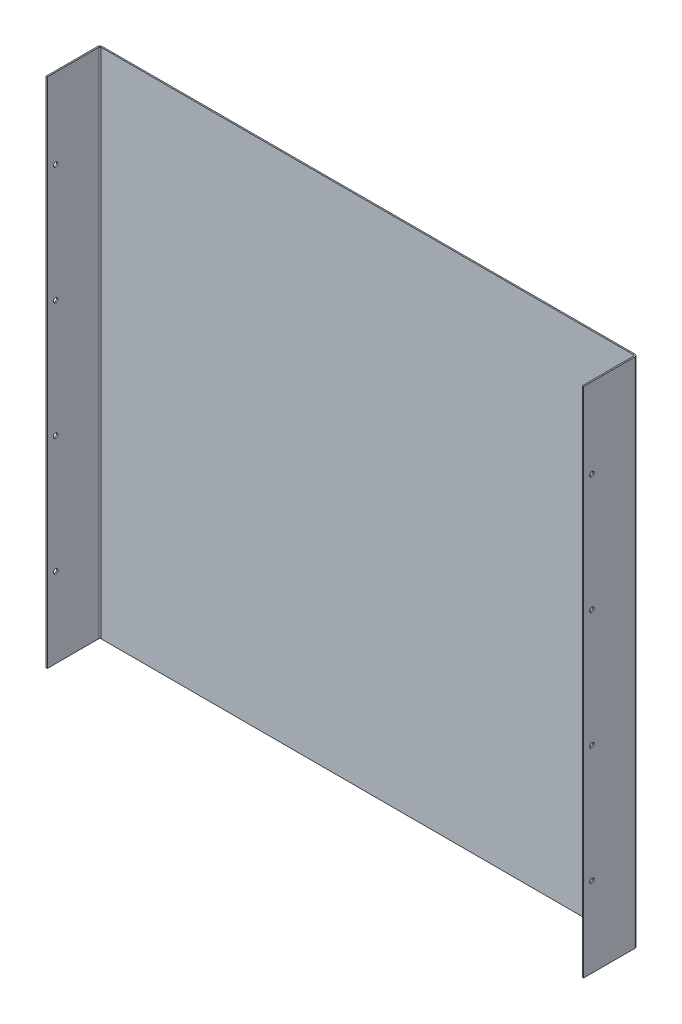
ISO-10303-21;
HEADER;
FILE_DESCRIPTION(('STEP AP214'),'2;1');
FILE_NAME('part.step','',(''),(''),'','','');
FILE_SCHEMA(('AUTOMOTIVE_DESIGN { 1 0 10303 214 1 1 1 1 }'));
ENDSEC;
DATA;
#1=APPLICATION_CONTEXT('core data for automotive mechanical design processes');
#2=APPLICATION_PROTOCOL_DEFINITION('international standard','automotive_design',2000,#1);
#3=PRODUCT_CONTEXT('',#1,'mechanical');
#4=PRODUCT('Part','Part','',(#3));
#5=PRODUCT_RELATED_PRODUCT_CATEGORY('part','',(#4));
#6=PRODUCT_DEFINITION_FORMATION('','',#4);
#7=PRODUCT_DEFINITION_CONTEXT('part definition',#1,'design');
#8=PRODUCT_DEFINITION('design','',#6,#7);
#9=PRODUCT_DEFINITION_SHAPE('','',#8);
#10=(LENGTH_UNIT() NAMED_UNIT(*) SI_UNIT(.MILLI.,.METRE.));
#11=(NAMED_UNIT(*) PLANE_ANGLE_UNIT() SI_UNIT($,.RADIAN.));
#12=(NAMED_UNIT(*) SI_UNIT($,.STERADIAN.) SOLID_ANGLE_UNIT());
#13=UNCERTAINTY_MEASURE_WITH_UNIT(LENGTH_MEASURE(1.E-05),#10,'distance_accuracy_value','');
#14=(GEOMETRIC_REPRESENTATION_CONTEXT(3) GLOBAL_UNCERTAINTY_ASSIGNED_CONTEXT((#13)) GLOBAL_UNIT_ASSIGNED_CONTEXT((#10,
#11,#12)) REPRESENTATION_CONTEXT('',''));
#15=CARTESIAN_POINT('',(0.,0.,0.));
#16=DIRECTION('',(0.,0.,1.));
#17=DIRECTION('',(1.,0.,0.));
#18=AXIS2_PLACEMENT_3D('',#15,#16,#17);
#19=CARTESIAN_POINT('',(0.,0.,0.));
#20=DIRECTION('',(1.,0.,0.));
#21=DIRECTION('',(0.,0.,-1.));
#22=AXIS2_PLACEMENT_3D('',#19,#20,#21);
#23=PLANE('',#22);
#24=CARTESIAN_POINT('',(-1.11022302462516E-13,337.5,35.499999999994));
#25=DIRECTION('',(-1.,0.,0.));
#26=DIRECTION('',(0.,0.,1.));
#27=AXIS2_PLACEMENT_3D('',#24,#25,#26);
#28=CIRCLE('',#27,1.75);
#29=CARTESIAN_POINT('',(-1.17132394805491E-13,337.5,37.249999999994));
#30=VERTEX_POINT('',#29);
#31=EDGE_CURVE('E108',#30,#30,#28,.F.);
#32=ORIENTED_EDGE('',*,*,#31,.T.);
#33=EDGE_LOOP('',(#32));
#34=FACE_BOUND('',#33,.T.);
#35=CARTESIAN_POINT('',(-1.11022302462516E-13,245.8,35.4999999999949));
#36=DIRECTION('',(-1.,0.,0.));
#37=DIRECTION('',(0.,0.,1.));
#38=AXIS2_PLACEMENT_3D('',#35,#36,#37);
#39=CIRCLE('',#38,1.75);
#40=CARTESIAN_POINT('',(-1.17132394805491E-13,245.8,37.2499999999949));
#41=VERTEX_POINT('',#40);
#42=EDGE_CURVE('E105',#41,#41,#39,.F.);
#43=ORIENTED_EDGE('',*,*,#42,.T.);
#44=EDGE_LOOP('',(#43));
#45=FACE_BOUND('',#44,.T.);
#46=CARTESIAN_POINT('',(-1.11022302462516E-13,154.2,35.4999999999958));
#47=DIRECTION('',(-1.,0.,0.));
#48=DIRECTION('',(0.,0.,1.));
#49=AXIS2_PLACEMENT_3D('',#46,#47,#48);
#50=CIRCLE('',#49,1.75);
#51=CARTESIAN_POINT('',(-1.17132394805491E-13,154.2,37.2499999999958));
#52=VERTEX_POINT('',#51);
#53=EDGE_CURVE('E101',#52,#52,#50,.F.);
#54=ORIENTED_EDGE('',*,*,#53,.T.);
#55=EDGE_LOOP('',(#54));
#56=FACE_BOUND('',#55,.T.);
#57=CARTESIAN_POINT('',(-1.11022302462516E-13,62.4999999999995,35.4999999999967));
#58=DIRECTION('',(-1.,0.,0.));
#59=DIRECTION('',(0.,0.,1.));
#60=AXIS2_PLACEMENT_3D('',#57,#58,#59);
#61=CIRCLE('',#60,1.75);
#62=CARTESIAN_POINT('',(-1.17132394805491E-13,62.4999999999995,37.2499999999967));
#63=VERTEX_POINT('',#62);
#64=EDGE_CURVE('E98',#63,#63,#61,.F.);
#65=ORIENTED_EDGE('',*,*,#64,.T.);
#66=EDGE_LOOP('',(#65));
#67=FACE_BOUND('',#66,.T.);
#68=DIRECTION('',(0.,0.,1.));
#69=VECTOR('',#68,1.);
#70=CARTESIAN_POINT('',(0.,0.,42.));
#71=LINE('',#70,#69);
#72=CARTESIAN_POINT('',(0.,0.,2.));
#73=VERTEX_POINT('',#72);
#74=CARTESIAN_POINT('',(0.,0.,42.));
#75=VERTEX_POINT('',#74);
#76=EDGE_CURVE('E97',#73,#75,#71,.T.);
#77=ORIENTED_EDGE('',*,*,#76,.T.);
#78=DIRECTION('',(0.,1.,0.));
#79=VECTOR('',#78,1.);
#80=CARTESIAN_POINT('',(-1.43172769279458E-13,400.,42.));
#81=LINE('',#80,#79);
#82=CARTESIAN_POINT('',(-1.43172769279458E-13,400.,42.));
#83=VERTEX_POINT('',#82);
#84=EDGE_CURVE('E180',#75,#83,#81,.T.);
#85=ORIENTED_EDGE('',*,*,#84,.T.);
#86=DIRECTION('',(0.,0.,-1.));
#87=VECTOR('',#86,1.);
#88=CARTESIAN_POINT('',(-1.43172769279458E-13,400.,0.999999999999997));
#89=LINE('',#88,#87);
#90=CARTESIAN_POINT('',(0.,400.,1.99999999999999));
#91=VERTEX_POINT('',#90);
#92=EDGE_CURVE('E181',#83,#91,#89,.T.);
#93=ORIENTED_EDGE('',*,*,#92,.T.);
#94=DIRECTION('',(0.,-1.,0.));
#95=VECTOR('',#94,1.);
#96=CARTESIAN_POINT('',(0.,0.,1.99999999999999));
#97=LINE('',#96,#95);
#98=EDGE_CURVE('E119',#73,#91,#97,.F.);
#99=ORIENTED_EDGE('',*,*,#98,.F.);
#100=EDGE_LOOP('',(#77,#85,#93,#99));
#101=FACE_BOUND('',#100,.T.);
#102=ADVANCED_FACE('F16',(#34,#45,#56,#67,#101),#23,.F.);
#103=CARTESIAN_POINT('',(419.7,0.,0.));
#104=DIRECTION('',(-1.,0.,0.));
#105=DIRECTION('',(0.,0.,1.));
#106=AXIS2_PLACEMENT_3D('',#103,#104,#105);
#107=PLANE('',#106);
#108=CARTESIAN_POINT('',(419.7,337.5,35.4999999999955));
#109=DIRECTION('',(-1.,0.,0.));
#110=DIRECTION('',(0.,0.,1.));
#111=AXIS2_PLACEMENT_3D('',#108,#109,#110);
#112=CIRCLE('',#111,1.75);
#113=CARTESIAN_POINT('',(419.7,337.5,37.2499999999955));
#114=VERTEX_POINT('',#113);
#115=EDGE_CURVE('E133',#114,#114,#112,.T.);
#116=ORIENTED_EDGE('',*,*,#115,.T.);
#117=EDGE_LOOP('',(#116));
#118=FACE_BOUND('',#117,.T.);
#119=CARTESIAN_POINT('',(419.7,245.8,35.4999999999964));
#120=DIRECTION('',(-1.,0.,0.));
#121=DIRECTION('',(0.,0.,1.));
#122=AXIS2_PLACEMENT_3D('',#119,#120,#121);
#123=CIRCLE('',#122,1.75);
#124=CARTESIAN_POINT('',(419.7,245.8,37.2499999999964));
#125=VERTEX_POINT('',#124);
#126=EDGE_CURVE('E130',#125,#125,#123,.T.);
#127=ORIENTED_EDGE('',*,*,#126,.T.);
#128=EDGE_LOOP('',(#127));
#129=FACE_BOUND('',#128,.T.);
#130=CARTESIAN_POINT('',(419.7,154.2,35.4999999999973));
#131=DIRECTION('',(-1.,0.,0.));
#132=DIRECTION('',(0.,0.,1.));
#133=AXIS2_PLACEMENT_3D('',#130,#131,#132);
#134=CIRCLE('',#133,1.75);
#135=CARTESIAN_POINT('',(419.7,154.2,37.2499999999973));
#136=VERTEX_POINT('',#135);
#137=EDGE_CURVE('E126',#136,#136,#134,.T.);
#138=ORIENTED_EDGE('',*,*,#137,.T.);
#139=EDGE_LOOP('',(#138));
#140=FACE_BOUND('',#139,.T.);
#141=CARTESIAN_POINT('',(419.7,62.4999999999995,35.4999999999982));
#142=DIRECTION('',(-1.,0.,0.));
#143=DIRECTION('',(0.,0.,1.));
#144=AXIS2_PLACEMENT_3D('',#141,#142,#143);
#145=CIRCLE('',#144,1.75);
#146=CARTESIAN_POINT('',(419.7,62.4999999999995,37.2499999999982));
#147=VERTEX_POINT('',#146);
#148=EDGE_CURVE('E123',#147,#147,#145,.T.);
#149=ORIENTED_EDGE('',*,*,#148,.T.);
#150=EDGE_LOOP('',(#149));
#151=FACE_BOUND('',#150,.T.);
#152=DIRECTION('',(0.,0.,-1.));
#153=VECTOR('',#152,1.);
#154=CARTESIAN_POINT('',(419.7,400.,42.));
#155=LINE('',#154,#153);
#156=CARTESIAN_POINT('',(419.7,400.,2.00000000000001));
#157=VERTEX_POINT('',#156);
#158=CARTESIAN_POINT('',(419.7,400.,42.));
#159=VERTEX_POINT('',#158);
#160=EDGE_CURVE('E122',#157,#159,#155,.F.);
#161=ORIENTED_EDGE('',*,*,#160,.T.);
#162=DIRECTION('',(0.,1.,0.));
#163=VECTOR('',#162,1.);
#164=CARTESIAN_POINT('',(419.7,0.,42.));
#165=LINE('',#164,#163);
#166=CARTESIAN_POINT('',(419.7,0.,42.));
#167=VERTEX_POINT('',#166);
#168=EDGE_CURVE('E226',#159,#167,#165,.F.);
#169=ORIENTED_EDGE('',*,*,#168,.T.);
#170=DIRECTION('',(0.,0.,1.));
#171=VECTOR('',#170,1.);
#172=CARTESIAN_POINT('',(419.7,0.,0.999999999999997));
#173=LINE('',#172,#171);
#174=CARTESIAN_POINT('',(419.7,0.,2.00000000000001));
#175=VERTEX_POINT('',#174);
#176=EDGE_CURVE('E208',#167,#175,#173,.F.);
#177=ORIENTED_EDGE('',*,*,#176,.T.);
#178=DIRECTION('',(0.,1.,0.));
#179=VECTOR('',#178,1.);
#180=CARTESIAN_POINT('',(419.7,400.,2.));
#181=LINE('',#180,#179);
#182=EDGE_CURVE('E112',#157,#175,#181,.F.);
#183=ORIENTED_EDGE('',*,*,#182,.F.);
#184=EDGE_LOOP('',(#161,#169,#177,#183));
#185=FACE_BOUND('',#184,.T.);
#186=ADVANCED_FACE('F251',(#118,#129,#140,#151,#185),#107,.F.);
#187=CARTESIAN_POINT('',(0.,400.,42.));
#188=DIRECTION('',(0.,0.,-1.));
#189=DIRECTION('',(-1.,0.,0.));
#190=AXIS2_PLACEMENT_3D('',#187,#188,#189);
#191=PLANE('',#190);
#192=DIRECTION('',(-1.,0.,0.));
#193=VECTOR('',#192,1.);
#194=CARTESIAN_POINT('',(0.,400.,42.));
#195=LINE('',#194,#193);
#196=CARTESIAN_POINT('',(0.999999999999926,400.,42.));
#197=VERTEX_POINT('',#196);
#198=EDGE_CURVE('E102',#83,#197,#195,.F.);
#199=ORIENTED_EDGE('',*,*,#198,.F.);
#200=ORIENTED_EDGE('',*,*,#84,.F.);
#201=DIRECTION('',(-1.,0.,0.));
#202=VECTOR('',#201,1.);
#203=CARTESIAN_POINT('',(0.,0.,42.));
#204=LINE('',#203,#202);
#205=CARTESIAN_POINT('',(0.999999999999856,0.,42.));
#206=VERTEX_POINT('',#205);
#207=EDGE_CURVE('E177',#206,#75,#204,.T.);
#208=ORIENTED_EDGE('',*,*,#207,.F.);
#209=DIRECTION('',(0.,1.,0.));
#210=VECTOR('',#209,1.);
#211=CARTESIAN_POINT('',(0.999999999999853,0.,42.));
#212=LINE('',#211,#210);
#213=EDGE_CURVE('E141',#197,#206,#212,.F.);
#214=ORIENTED_EDGE('',*,*,#213,.F.);
#215=EDGE_LOOP('',(#199,#200,#208,#214));
#216=FACE_BOUND('',#215,.T.);
#217=ADVANCED_FACE('F283',(#216),#191,.F.);
#218=CARTESIAN_POINT('',(419.7,62.4999999999995,35.4999999999982));
#219=DIRECTION('',(-1.,0.,0.));
#220=DIRECTION('',(0.,0.,1.));
#221=AXIS2_PLACEMENT_3D('',#218,#219,#220);
#222=CYLINDRICAL_SURFACE('',#221,1.75);
#223=ORIENTED_EDGE('',*,*,#64,.F.);
#224=EDGE_LOOP('',(#223));
#225=FACE_BOUND('',#224,.T.);
#226=CARTESIAN_POINT('',(0.99999999999989,62.4999999999995,35.4999999999967));
#227=DIRECTION('',(-1.,0.,0.));
#228=DIRECTION('',(0.,0.,1.));
#229=AXIS2_PLACEMENT_3D('',#226,#227,#228);
#230=CIRCLE('',#229,1.75);
#231=CARTESIAN_POINT('',(0.999999999999884,62.4999999999995,37.2499999999967));
#232=VERTEX_POINT('',#231);
#233=EDGE_CURVE('E137',#232,#232,#230,.T.);
#234=ORIENTED_EDGE('',*,*,#233,.F.);
#235=EDGE_LOOP('',(#234));
#236=FACE_BOUND('',#235,.T.);
#237=ADVANCED_FACE('F449',(#225,#236),#222,.F.);
#238=CARTESIAN_POINT('',(419.7,154.2,35.4999999999973));
#239=DIRECTION('',(-1.,0.,0.));
#240=DIRECTION('',(0.,0.,1.));
#241=AXIS2_PLACEMENT_3D('',#238,#239,#240);
#242=CYLINDRICAL_SURFACE('',#241,1.75);
#243=ORIENTED_EDGE('',*,*,#53,.F.);
#244=EDGE_LOOP('',(#243));
#245=FACE_BOUND('',#244,.T.);
#246=CARTESIAN_POINT('',(0.99999999999989,154.2,35.4999999999958));
#247=DIRECTION('',(-1.,0.,0.));
#248=DIRECTION('',(0.,0.,1.));
#249=AXIS2_PLACEMENT_3D('',#246,#247,#248);
#250=CIRCLE('',#249,1.75);
#251=CARTESIAN_POINT('',(0.999999999999884,154.2,37.2499999999958));
#252=VERTEX_POINT('',#251);
#253=EDGE_CURVE('E140',#252,#252,#250,.T.);
#254=ORIENTED_EDGE('',*,*,#253,.F.);
#255=EDGE_LOOP('',(#254));
#256=FACE_BOUND('',#255,.T.);
#257=ADVANCED_FACE('F439',(#245,#256),#242,.F.);
#258=CARTESIAN_POINT('',(419.7,245.8,35.4999999999964));
#259=DIRECTION('',(-1.,0.,0.));
#260=DIRECTION('',(0.,0.,1.));
#261=AXIS2_PLACEMENT_3D('',#258,#259,#260);
#262=CYLINDRICAL_SURFACE('',#261,1.75);
#263=ORIENTED_EDGE('',*,*,#42,.F.);
#264=EDGE_LOOP('',(#263));
#265=FACE_BOUND('',#264,.T.);
#266=CARTESIAN_POINT('',(0.99999999999989,245.8,35.4999999999949));
#267=DIRECTION('',(-1.,0.,0.));
#268=DIRECTION('',(0.,0.,1.));
#269=AXIS2_PLACEMENT_3D('',#266,#267,#268);
#270=CIRCLE('',#269,1.75);
#271=CARTESIAN_POINT('',(0.999999999999884,245.8,37.2499999999949));
#272=VERTEX_POINT('',#271);
#273=EDGE_CURVE('E144',#272,#272,#270,.T.);
#274=ORIENTED_EDGE('',*,*,#273,.F.);
#275=EDGE_LOOP('',(#274));
#276=FACE_BOUND('',#275,.T.);
#277=ADVANCED_FACE('F429',(#265,#276),#262,.F.);
#278=CARTESIAN_POINT('',(419.7,337.5,35.4999999999955));
#279=DIRECTION('',(-1.,0.,0.));
#280=DIRECTION('',(0.,0.,1.));
#281=AXIS2_PLACEMENT_3D('',#278,#279,#280);
#282=CYLINDRICAL_SURFACE('',#281,1.75);
#283=ORIENTED_EDGE('',*,*,#31,.F.);
#284=EDGE_LOOP('',(#283));
#285=FACE_BOUND('',#284,.T.);
#286=CARTESIAN_POINT('',(0.99999999999989,337.5,35.499999999994));
#287=DIRECTION('',(-1.,0.,0.));
#288=DIRECTION('',(0.,0.,1.));
#289=AXIS2_PLACEMENT_3D('',#286,#287,#288);
#290=CIRCLE('',#289,1.75);
#291=CARTESIAN_POINT('',(0.999999999999884,337.5,37.249999999994));
#292=VERTEX_POINT('',#291);
#293=EDGE_CURVE('E147',#292,#292,#290,.T.);
#294=ORIENTED_EDGE('',*,*,#293,.F.);
#295=EDGE_LOOP('',(#294));
#296=FACE_BOUND('',#295,.T.);
#297=ADVANCED_FACE('F420',(#285,#296),#282,.F.);
#298=CARTESIAN_POINT('',(417.7,400.,2.00000000000001));
#299=DIRECTION('',(0.,1.,0.));
#300=DIRECTION('',(0.,0.,1.));
#301=AXIS2_PLACEMENT_3D('',#298,#299,#300);
#302=CYLINDRICAL_SURFACE('',#301,2.);
#303=ORIENTED_EDGE('',*,*,#182,.T.);
#304=CARTESIAN_POINT('',(417.7,0.,2.00000000000001));
#305=DIRECTION('',(0.,1.,0.));
#306=DIRECTION('',(0.,0.,1.));
#307=AXIS2_PLACEMENT_3D('',#304,#305,#306);
#308=CIRCLE('',#307,2.);
#309=CARTESIAN_POINT('',(417.7,0.,0.));
#310=VERTEX_POINT('',#309);
#311=EDGE_CURVE('E113',#175,#310,#308,.T.);
#312=ORIENTED_EDGE('',*,*,#311,.T.);
#313=DIRECTION('',(0.,1.,0.));
#314=VECTOR('',#313,1.);
#315=CARTESIAN_POINT('',(417.7,0.,0.));
#316=LINE('',#315,#314);
#317=CARTESIAN_POINT('',(417.7,400.,0.));
#318=VERTEX_POINT('',#317);
#319=EDGE_CURVE('E150',#318,#310,#316,.F.);
#320=ORIENTED_EDGE('',*,*,#319,.F.);
#321=CARTESIAN_POINT('',(417.7,400.,2.00000000000001));
#322=DIRECTION('',(0.,1.,0.));
#323=DIRECTION('',(0.,0.,1.));
#324=AXIS2_PLACEMENT_3D('',#321,#322,#323);
#325=CIRCLE('',#324,2.);
#326=EDGE_CURVE('E34',#318,#157,#325,.F.);
#327=ORIENTED_EDGE('',*,*,#326,.T.);
#328=EDGE_LOOP('',(#303,#312,#320,#327));
#329=FACE_BOUND('',#328,.T.);
#330=ADVANCED_FACE('F271',(#329),#302,.T.);
#331=CARTESIAN_POINT('',(2.,0.,2.));
#332=DIRECTION('',(0.,-1.,0.));
#333=DIRECTION('',(0.,0.,-1.));
#334=AXIS2_PLACEMENT_3D('',#331,#332,#333);
#335=CYLINDRICAL_SURFACE('',#334,2.);
#336=ORIENTED_EDGE('',*,*,#98,.T.);
#337=CARTESIAN_POINT('',(2.,400.,2.));
#338=DIRECTION('',(0.,-1.,0.));
#339=DIRECTION('',(0.,0.,-1.));
#340=AXIS2_PLACEMENT_3D('',#337,#338,#339);
#341=CIRCLE('',#340,2.);
#342=CARTESIAN_POINT('',(2.,400.,0.));
#343=VERTEX_POINT('',#342);
#344=EDGE_CURVE('E120',#91,#343,#341,.T.);
#345=ORIENTED_EDGE('',*,*,#344,.T.);
#346=DIRECTION('',(0.,1.,0.));
#347=VECTOR('',#346,1.);
#348=CARTESIAN_POINT('',(2.,0.,0.));
#349=LINE('',#348,#347);
#350=CARTESIAN_POINT('',(2.,0.,0.));
#351=VERTEX_POINT('',#350);
#352=EDGE_CURVE('E168',#351,#343,#349,.T.);
#353=ORIENTED_EDGE('',*,*,#352,.F.);
#354=CARTESIAN_POINT('',(2.,0.,2.));
#355=DIRECTION('',(0.,-1.,0.));
#356=DIRECTION('',(0.,0.,-1.));
#357=AXIS2_PLACEMENT_3D('',#354,#355,#356);
#358=CIRCLE('',#357,2.);
#359=EDGE_CURVE('E116',#351,#73,#358,.F.);
#360=ORIENTED_EDGE('',*,*,#359,.T.);
#361=EDGE_LOOP('',(#336,#345,#353,#360));
#362=FACE_BOUND('',#361,.T.);
#363=ADVANCED_FACE('F279',(#362),#335,.T.);
#364=CARTESIAN_POINT('',(419.7,0.,42.));
#365=DIRECTION('',(0.,0.,-1.));
#366=DIRECTION('',(-1.,0.,0.));
#367=AXIS2_PLACEMENT_3D('',#364,#365,#366);
#368=PLANE('',#367);
#369=DIRECTION('',(-1.,0.,0.));
#370=VECTOR('',#369,1.);
#371=CARTESIAN_POINT('',(419.7,0.,42.));
#372=LINE('',#371,#370);
#373=CARTESIAN_POINT('',(418.7,0.,42.));
#374=VERTEX_POINT('',#373);
#375=EDGE_CURVE('E127',#167,#374,#372,.T.);
#376=ORIENTED_EDGE('',*,*,#375,.F.);
#377=ORIENTED_EDGE('',*,*,#168,.F.);
#378=DIRECTION('',(-1.,0.,0.));
#379=VECTOR('',#378,1.);
#380=CARTESIAN_POINT('',(419.7,400.,42.));
#381=LINE('',#380,#379);
#382=CARTESIAN_POINT('',(418.7,400.,42.));
#383=VERTEX_POINT('',#382);
#384=EDGE_CURVE('E211',#383,#159,#381,.F.);
#385=ORIENTED_EDGE('',*,*,#384,.F.);
#386=DIRECTION('',(0.,1.,0.));
#387=VECTOR('',#386,1.);
#388=CARTESIAN_POINT('',(418.7,0.,42.));
#389=LINE('',#388,#387);
#390=EDGE_CURVE('E155',#374,#383,#389,.T.);
#391=ORIENTED_EDGE('',*,*,#390,.F.);
#392=EDGE_LOOP('',(#376,#377,#385,#391));
#393=FACE_BOUND('',#392,.T.);
#394=ADVANCED_FACE('F249',(#393),#368,.F.);
#395=CARTESIAN_POINT('',(419.7,62.4999999999995,35.4999999999982));
#396=DIRECTION('',(-1.,0.,0.));
#397=DIRECTION('',(0.,0.,1.));
#398=AXIS2_PLACEMENT_3D('',#395,#396,#397);
#399=CYLINDRICAL_SURFACE('',#398,1.75);
#400=CARTESIAN_POINT('',(418.7,62.4999999999995,35.4999999999982));
#401=DIRECTION('',(-1.,0.,0.));
#402=DIRECTION('',(0.,0.,1.));
#403=AXIS2_PLACEMENT_3D('',#400,#401,#402);
#404=CIRCLE('',#403,1.75);
#405=CARTESIAN_POINT('',(418.7,62.4999999999995,37.2499999999982));
#406=VERTEX_POINT('',#405);
#407=EDGE_CURVE('E151',#406,#406,#404,.F.);
#408=ORIENTED_EDGE('',*,*,#407,.F.);
#409=EDGE_LOOP('',(#408));
#410=FACE_BOUND('',#409,.T.);
#411=ORIENTED_EDGE('',*,*,#148,.F.);
#412=EDGE_LOOP('',(#411));
#413=FACE_BOUND('',#412,.T.);
#414=ADVANCED_FACE('F385',(#410,#413),#399,.F.);
#415=CARTESIAN_POINT('',(419.7,154.2,35.4999999999973));
#416=DIRECTION('',(-1.,0.,0.));
#417=DIRECTION('',(0.,0.,1.));
#418=AXIS2_PLACEMENT_3D('',#415,#416,#417);
#419=CYLINDRICAL_SURFACE('',#418,1.75);
#420=CARTESIAN_POINT('',(418.7,154.2,35.4999999999973));
#421=DIRECTION('',(-1.,0.,0.));
#422=DIRECTION('',(0.,0.,1.));
#423=AXIS2_PLACEMENT_3D('',#420,#421,#422);
#424=CIRCLE('',#423,1.75);
#425=CARTESIAN_POINT('',(418.7,154.2,37.2499999999973));
#426=VERTEX_POINT('',#425);
#427=EDGE_CURVE('E154',#426,#426,#424,.F.);
#428=ORIENTED_EDGE('',*,*,#427,.F.);
#429=EDGE_LOOP('',(#428));
#430=FACE_BOUND('',#429,.T.);
#431=ORIENTED_EDGE('',*,*,#137,.F.);
#432=EDGE_LOOP('',(#431));
#433=FACE_BOUND('',#432,.T.);
#434=ADVANCED_FACE('F375',(#430,#433),#419,.F.);
#435=CARTESIAN_POINT('',(419.7,245.8,35.4999999999964));
#436=DIRECTION('',(-1.,0.,0.));
#437=DIRECTION('',(0.,0.,1.));
#438=AXIS2_PLACEMENT_3D('',#435,#436,#437);
#439=CYLINDRICAL_SURFACE('',#438,1.75);
#440=CARTESIAN_POINT('',(418.7,245.8,35.4999999999964));
#441=DIRECTION('',(-1.,0.,0.));
#442=DIRECTION('',(0.,0.,1.));
#443=AXIS2_PLACEMENT_3D('',#440,#441,#442);
#444=CIRCLE('',#443,1.75);
#445=CARTESIAN_POINT('',(418.7,245.8,37.2499999999964));
#446=VERTEX_POINT('',#445);
#447=EDGE_CURVE('E158',#446,#446,#444,.F.);
#448=ORIENTED_EDGE('',*,*,#447,.F.);
#449=EDGE_LOOP('',(#448));
#450=FACE_BOUND('',#449,.T.);
#451=ORIENTED_EDGE('',*,*,#126,.F.);
#452=EDGE_LOOP('',(#451));
#453=FACE_BOUND('',#452,.T.);
#454=ADVANCED_FACE('F365',(#450,#453),#439,.F.);
#455=CARTESIAN_POINT('',(419.7,337.5,35.4999999999955));
#456=DIRECTION('',(-1.,0.,0.));
#457=DIRECTION('',(0.,0.,1.));
#458=AXIS2_PLACEMENT_3D('',#455,#456,#457);
#459=CYLINDRICAL_SURFACE('',#458,1.75);
#460=CARTESIAN_POINT('',(418.7,337.5,35.4999999999955));
#461=DIRECTION('',(-1.,0.,0.));
#462=DIRECTION('',(0.,0.,1.));
#463=AXIS2_PLACEMENT_3D('',#460,#461,#462);
#464=CIRCLE('',#463,1.75);
#465=CARTESIAN_POINT('',(418.7,337.5,37.2499999999955));
#466=VERTEX_POINT('',#465);
#467=EDGE_CURVE('E161',#466,#466,#464,.F.);
#468=ORIENTED_EDGE('',*,*,#467,.F.);
#469=EDGE_LOOP('',(#468));
#470=FACE_BOUND('',#469,.T.);
#471=ORIENTED_EDGE('',*,*,#115,.F.);
#472=EDGE_LOOP('',(#471));
#473=FACE_BOUND('',#472,.T.);
#474=ADVANCED_FACE('F355',(#470,#473),#459,.F.);
#475=CARTESIAN_POINT('',(1.,0.,0.));
#476=DIRECTION('',(1.,0.,0.));
#477=DIRECTION('',(0.,0.,-1.));
#478=AXIS2_PLACEMENT_3D('',#475,#476,#477);
#479=PLANE('',#478);
#480=ORIENTED_EDGE('',*,*,#293,.T.);
#481=EDGE_LOOP('',(#480));
#482=FACE_BOUND('',#481,.T.);
#483=ORIENTED_EDGE('',*,*,#273,.T.);
#484=EDGE_LOOP('',(#483));
#485=FACE_BOUND('',#484,.T.);
#486=ORIENTED_EDGE('',*,*,#253,.T.);
#487=EDGE_LOOP('',(#486));
#488=FACE_BOUND('',#487,.T.);
#489=ORIENTED_EDGE('',*,*,#233,.T.);
#490=EDGE_LOOP('',(#489));
#491=FACE_BOUND('',#490,.T.);
#492=DIRECTION('',(0.,0.,-1.));
#493=VECTOR('',#492,1.);
#494=CARTESIAN_POINT('',(1.,400.,0.));
#495=LINE('',#494,#493);
#496=CARTESIAN_POINT('',(0.999999999999997,400.,1.99999999999999));
#497=VERTEX_POINT('',#496);
#498=EDGE_CURVE('E188',#497,#197,#495,.F.);
#499=ORIENTED_EDGE('',*,*,#498,.T.);
#500=ORIENTED_EDGE('',*,*,#213,.T.);
#501=DIRECTION('',(0.,0.,-1.));
#502=VECTOR('',#501,1.);
#503=CARTESIAN_POINT('',(1.,0.,0.));
#504=LINE('',#503,#502);
#505=CARTESIAN_POINT('',(0.999999999999997,0.,2.));
#506=VERTEX_POINT('',#505);
#507=EDGE_CURVE('E136',#206,#506,#504,.T.);
#508=ORIENTED_EDGE('',*,*,#507,.T.);
#509=DIRECTION('',(0.,-1.,0.));
#510=VECTOR('',#509,1.);
#511=CARTESIAN_POINT('',(1.,0.,2.));
#512=LINE('',#511,#510);
#513=EDGE_CURVE('E197',#506,#497,#512,.F.);
#514=ORIENTED_EDGE('',*,*,#513,.T.);
#515=EDGE_LOOP('',(#499,#500,#508,#514));
#516=FACE_BOUND('',#515,.T.);
#517=ADVANCED_FACE('F289',(#482,#485,#488,#491,#516),#479,.T.);
#518=CARTESIAN_POINT('',(0.,0.,0.));
#519=DIRECTION('',(0.,0.,-1.));
#520=DIRECTION('',(-1.,0.,0.));
#521=AXIS2_PLACEMENT_3D('',#518,#519,#520);
#522=PLANE('',#521);
#523=DIRECTION('',(1.,0.,0.));
#524=VECTOR('',#523,1.);
#525=CARTESIAN_POINT('',(0.,0.,0.));
#526=LINE('',#525,#524);
#527=EDGE_CURVE('E164',#310,#351,#526,.F.);
#528=ORIENTED_EDGE('',*,*,#527,.T.);
#529=ORIENTED_EDGE('',*,*,#352,.T.);
#530=DIRECTION('',(1.,0.,0.));
#531=VECTOR('',#530,1.);
#532=CARTESIAN_POINT('',(0.,400.,0.));
#533=LINE('',#532,#531);
#534=EDGE_CURVE('E170',#343,#318,#533,.T.);
#535=ORIENTED_EDGE('',*,*,#534,.T.);
#536=ORIENTED_EDGE('',*,*,#319,.T.);
#537=EDGE_LOOP('',(#528,#529,#535,#536));
#538=FACE_BOUND('',#537,.T.);
#539=ADVANCED_FACE('F274',(#538),#522,.T.);
#540=CARTESIAN_POINT('',(418.7,0.,0.));
#541=DIRECTION('',(-1.,0.,0.));
#542=DIRECTION('',(0.,0.,1.));
#543=AXIS2_PLACEMENT_3D('',#540,#541,#542);
#544=PLANE('',#543);
#545=ORIENTED_EDGE('',*,*,#467,.T.);
#546=EDGE_LOOP('',(#545));
#547=FACE_BOUND('',#546,.T.);
#548=ORIENTED_EDGE('',*,*,#447,.T.);
#549=EDGE_LOOP('',(#548));
#550=FACE_BOUND('',#549,.T.);
#551=ORIENTED_EDGE('',*,*,#427,.T.);
#552=EDGE_LOOP('',(#551));
#553=FACE_BOUND('',#552,.T.);
#554=ORIENTED_EDGE('',*,*,#407,.T.);
#555=EDGE_LOOP('',(#554));
#556=FACE_BOUND('',#555,.T.);
#557=DIRECTION('',(0.,0.,1.));
#558=VECTOR('',#557,1.);
#559=CARTESIAN_POINT('',(418.7,0.,0.));
#560=LINE('',#559,#558);
#561=CARTESIAN_POINT('',(418.7,0.,2.));
#562=VERTEX_POINT('',#561);
#563=EDGE_CURVE('E167',#562,#374,#560,.T.);
#564=ORIENTED_EDGE('',*,*,#563,.T.);
#565=ORIENTED_EDGE('',*,*,#390,.T.);
#566=DIRECTION('',(0.,0.,1.));
#567=VECTOR('',#566,1.);
#568=CARTESIAN_POINT('',(418.7,400.,0.));
#569=LINE('',#568,#567);
#570=CARTESIAN_POINT('',(418.7,400.,2.));
#571=VERTEX_POINT('',#570);
#572=EDGE_CURVE('E165',#383,#571,#569,.F.);
#573=ORIENTED_EDGE('',*,*,#572,.T.);
#574=DIRECTION('',(0.,1.,0.));
#575=VECTOR('',#574,1.);
#576=CARTESIAN_POINT('',(418.7,400.,2.));
#577=LINE('',#576,#575);
#578=EDGE_CURVE('E87',#571,#562,#577,.F.);
#579=ORIENTED_EDGE('',*,*,#578,.T.);
#580=EDGE_LOOP('',(#564,#565,#573,#579));
#581=FACE_BOUND('',#580,.T.);
#582=ADVANCED_FACE('F237',(#547,#550,#553,#556,#581),#544,.T.);
#583=CARTESIAN_POINT('',(0.,0.,1.));
#584=DIRECTION('',(0.,1.,0.));
#585=DIRECTION('',(0.,0.,1.));
#586=AXIS2_PLACEMENT_3D('',#583,#584,#585);
#587=PLANE('',#586);
#588=DIRECTION('',(-1.,0.,0.));
#589=VECTOR('',#588,1.);
#590=CARTESIAN_POINT('',(0.,0.,1.));
#591=LINE('',#590,#589);
#592=CARTESIAN_POINT('',(417.7,0.,1.00000000000001));
#593=VERTEX_POINT('',#592);
#594=CARTESIAN_POINT('',(2.,0.,1.));
#595=VERTEX_POINT('',#594);
#596=EDGE_CURVE('E83',#593,#595,#591,.T.);
#597=ORIENTED_EDGE('',*,*,#596,.T.);
#598=CARTESIAN_POINT('',(2.,0.,2.));
#599=DIRECTION('',(0.,-1.,0.));
#600=DIRECTION('',(0.,0.,-1.));
#601=AXIS2_PLACEMENT_3D('',#598,#599,#600);
#602=CIRCLE('',#601,1.);
#603=EDGE_CURVE('E90',#506,#595,#602,.T.);
#604=ORIENTED_EDGE('',*,*,#603,.F.);
#605=ORIENTED_EDGE('',*,*,#507,.F.);
#606=ORIENTED_EDGE('',*,*,#207,.T.);
#607=ORIENTED_EDGE('',*,*,#76,.F.);
#608=ORIENTED_EDGE('',*,*,#359,.F.);
#609=ORIENTED_EDGE('',*,*,#527,.F.);
#610=ORIENTED_EDGE('',*,*,#311,.F.);
#611=ORIENTED_EDGE('',*,*,#176,.F.);
#612=ORIENTED_EDGE('',*,*,#375,.T.);
#613=ORIENTED_EDGE('',*,*,#563,.F.);
#614=CARTESIAN_POINT('',(417.7,0.,2.00000000000001));
#615=DIRECTION('',(0.,1.,0.));
#616=DIRECTION('',(0.,0.,1.));
#617=AXIS2_PLACEMENT_3D('',#614,#615,#616);
#618=CIRCLE('',#617,1.);
#619=EDGE_CURVE('E89',#562,#593,#618,.T.);
#620=ORIENTED_EDGE('',*,*,#619,.T.);
#621=EDGE_LOOP('',(#597,#604,#605,#606,#607,#608,#609,#610,#611,#612,#613,#620));
#622=FACE_BOUND('',#621,.T.);
#623=ADVANCED_FACE('F286',(#622),#587,.F.);
#624=CARTESIAN_POINT('',(2.,0.,2.));
#625=DIRECTION('',(0.,-1.,0.));
#626=DIRECTION('',(0.,0.,-1.));
#627=AXIS2_PLACEMENT_3D('',#624,#625,#626);
#628=CYLINDRICAL_SURFACE('',#627,1.);
#629=CARTESIAN_POINT('',(2.,400.,2.));
#630=DIRECTION('',(0.,-1.,0.));
#631=DIRECTION('',(0.,0.,-1.));
#632=AXIS2_PLACEMENT_3D('',#629,#630,#631);
#633=CIRCLE('',#632,1.);
#634=CARTESIAN_POINT('',(2.,400.,1.));
#635=VERTEX_POINT('',#634);
#636=EDGE_CURVE('E75',#497,#635,#633,.T.);
#637=ORIENTED_EDGE('',*,*,#636,.F.);
#638=ORIENTED_EDGE('',*,*,#513,.F.);
#639=ORIENTED_EDGE('',*,*,#603,.T.);
#640=DIRECTION('',(0.,1.,0.));
#641=VECTOR('',#640,1.);
#642=CARTESIAN_POINT('',(2.,0.,1.));
#643=LINE('',#642,#641);
#644=EDGE_CURVE('E79',#595,#635,#643,.T.);
#645=ORIENTED_EDGE('',*,*,#644,.T.);
#646=EDGE_LOOP('',(#637,#638,#639,#645));
#647=FACE_BOUND('',#646,.T.);
#648=ADVANCED_FACE('F291',(#647),#628,.F.);
#649=CARTESIAN_POINT('',(0.,400.,1.));
#650=DIRECTION('',(0.,-1.,0.));
#651=DIRECTION('',(0.,0.,-1.));
#652=AXIS2_PLACEMENT_3D('',#649,#650,#651);
#653=PLANE('',#652);
#654=DIRECTION('',(-1.,0.,0.));
#655=VECTOR('',#654,1.);
#656=CARTESIAN_POINT('',(0.,400.,1.));
#657=LINE('',#656,#655);
#658=CARTESIAN_POINT('',(417.7,400.,1.00000000000001));
#659=VERTEX_POINT('',#658);
#660=EDGE_CURVE('E25',#635,#659,#657,.F.);
#661=ORIENTED_EDGE('',*,*,#660,.T.);
#662=CARTESIAN_POINT('',(417.7,400.,2.00000000000001));
#663=DIRECTION('',(0.,1.,0.));
#664=DIRECTION('',(0.,0.,1.));
#665=AXIS2_PLACEMENT_3D('',#662,#663,#664);
#666=CIRCLE('',#665,1.);
#667=EDGE_CURVE('E19',#571,#659,#666,.T.);
#668=ORIENTED_EDGE('',*,*,#667,.F.);
#669=ORIENTED_EDGE('',*,*,#572,.F.);
#670=ORIENTED_EDGE('',*,*,#384,.T.);
#671=ORIENTED_EDGE('',*,*,#160,.F.);
#672=ORIENTED_EDGE('',*,*,#326,.F.);
#673=ORIENTED_EDGE('',*,*,#534,.F.);
#674=ORIENTED_EDGE('',*,*,#344,.F.);
#675=ORIENTED_EDGE('',*,*,#92,.F.);
#676=ORIENTED_EDGE('',*,*,#198,.T.);
#677=ORIENTED_EDGE('',*,*,#498,.F.);
#678=ORIENTED_EDGE('',*,*,#636,.T.);
#679=EDGE_LOOP('',(#661,#668,#669,#670,#671,#672,#673,#674,#675,#676,#677,#678));
#680=FACE_BOUND('',#679,.T.);
#681=ADVANCED_FACE('F73',(#680),#653,.F.);
#682=CARTESIAN_POINT('',(417.7,400.,2.00000000000001));
#683=DIRECTION('',(0.,1.,0.));
#684=DIRECTION('',(0.,0.,1.));
#685=AXIS2_PLACEMENT_3D('',#682,#683,#684);
#686=CYLINDRICAL_SURFACE('',#685,1.);
#687=ORIENTED_EDGE('',*,*,#619,.F.);
#688=ORIENTED_EDGE('',*,*,#578,.F.);
#689=ORIENTED_EDGE('',*,*,#667,.T.);
#690=DIRECTION('',(0.,1.,0.));
#691=VECTOR('',#690,1.);
#692=CARTESIAN_POINT('',(417.7,0.,1.));
#693=LINE('',#692,#691);
#694=EDGE_CURVE('E11',#659,#593,#693,.F.);
#695=ORIENTED_EDGE('',*,*,#694,.T.);
#696=EDGE_LOOP('',(#687,#688,#689,#695));
#697=FACE_BOUND('',#696,.T.);
#698=ADVANCED_FACE('F86',(#697),#686,.F.);
#699=CARTESIAN_POINT('',(0.,0.,1.));
#700=DIRECTION('',(0.,0.,-1.));
#701=DIRECTION('',(-1.,0.,0.));
#702=AXIS2_PLACEMENT_3D('',#699,#700,#701);
#703=PLANE('',#702);
#704=ORIENTED_EDGE('',*,*,#660,.F.);
#705=ORIENTED_EDGE('',*,*,#644,.F.);
#706=ORIENTED_EDGE('',*,*,#596,.F.);
#707=ORIENTED_EDGE('',*,*,#694,.F.);
#708=EDGE_LOOP('',(#704,#705,#706,#707));
#709=FACE_BOUND('',#708,.T.);
#710=ADVANCED_FACE('F82',(#709),#703,.F.);
#711=CLOSED_SHELL('',(#102,#186,#217,#237,#257,#277,#297,#330,#363,#394,#414,#434,#454,#474,
#517,#539,#582,#623,#648,#681,#698,#710));
#712=MANIFOLD_SOLID_BREP('B1',#711);
#713=ADVANCED_BREP_SHAPE_REPRESENTATION('',(#18,#712),#14);
#714=SHAPE_DEFINITION_REPRESENTATION(#9,#713);
ENDSEC;
END-ISO-10303-21;
